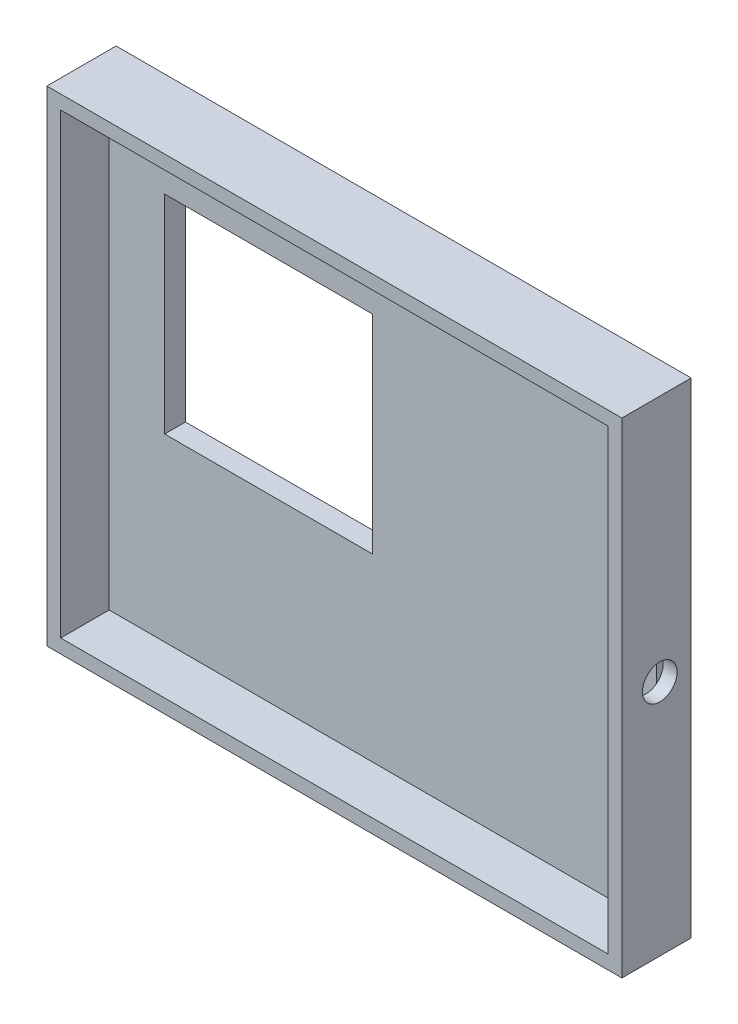
ISO-10303-21;
HEADER;
FILE_DESCRIPTION(('STEP AP214'),'2;1');
FILE_NAME('part.step','',(''),(''),'','','');
FILE_SCHEMA(('AUTOMOTIVE_DESIGN { 1 0 10303 214 1 1 1 1 }'));
ENDSEC;
DATA;
#1=APPLICATION_CONTEXT('core data for automotive mechanical design processes');
#2=APPLICATION_PROTOCOL_DEFINITION('international standard','automotive_design',2000,#1);
#3=PRODUCT_CONTEXT('',#1,'mechanical');
#4=PRODUCT('Part','Part','',(#3));
#5=PRODUCT_RELATED_PRODUCT_CATEGORY('part','',(#4));
#6=PRODUCT_DEFINITION_FORMATION('','',#4);
#7=PRODUCT_DEFINITION_CONTEXT('part definition',#1,'design');
#8=PRODUCT_DEFINITION('design','',#6,#7);
#9=PRODUCT_DEFINITION_SHAPE('','',#8);
#10=(LENGTH_UNIT() NAMED_UNIT(*) SI_UNIT(.MILLI.,.METRE.));
#11=(NAMED_UNIT(*) PLANE_ANGLE_UNIT() SI_UNIT($,.RADIAN.));
#12=(NAMED_UNIT(*) SI_UNIT($,.STERADIAN.) SOLID_ANGLE_UNIT());
#13=UNCERTAINTY_MEASURE_WITH_UNIT(LENGTH_MEASURE(1.E-05),#10,'distance_accuracy_value','');
#14=(GEOMETRIC_REPRESENTATION_CONTEXT(3) GLOBAL_UNCERTAINTY_ASSIGNED_CONTEXT((#13)) GLOBAL_UNIT_ASSIGNED_CONTEXT((#10,
#11,#12)) REPRESENTATION_CONTEXT('',''));
#15=CARTESIAN_POINT('',(0.,0.,0.));
#16=DIRECTION('',(0.,0.,1.));
#17=DIRECTION('',(1.,0.,0.));
#18=AXIS2_PLACEMENT_3D('',#15,#16,#17);
#19=CARTESIAN_POINT('',(0.,0.,10.));
#20=DIRECTION('',(1.,0.,0.));
#21=DIRECTION('',(0.,0.,-1.));
#22=AXIS2_PLACEMENT_3D('',#19,#20,#21);
#23=PLANE('',#22);
#24=DIRECTION('',(0.,-1.,0.));
#25=VECTOR('',#24,1.);
#26=CARTESIAN_POINT('',(0.,0.,0.));
#27=LINE('',#26,#25);
#28=CARTESIAN_POINT('',(0.,70.,0.));
#29=VERTEX_POINT('',#28);
#30=CARTESIAN_POINT('',(0.,0.,0.));
#31=VERTEX_POINT('',#30);
#32=EDGE_CURVE('E211',#29,#31,#27,.T.);
#33=ORIENTED_EDGE('',*,*,#32,.T.);
#34=DIRECTION('',(0.,0.,-1.));
#35=VECTOR('',#34,1.);
#36=CARTESIAN_POINT('',(0.,0.,10.));
#37=LINE('',#36,#35);
#38=CARTESIAN_POINT('',(0.,0.,10.));
#39=VERTEX_POINT('',#38);
#40=EDGE_CURVE('E221',#39,#31,#37,.T.);
#41=ORIENTED_EDGE('',*,*,#40,.F.);
#42=DIRECTION('',(0.,-1.,0.));
#43=VECTOR('',#42,1.);
#44=CARTESIAN_POINT('',(0.,0.,10.));
#45=LINE('',#44,#43);
#46=CARTESIAN_POINT('',(0.,70.,10.));
#47=VERTEX_POINT('',#46);
#48=EDGE_CURVE('E212',#47,#39,#45,.T.);
#49=ORIENTED_EDGE('',*,*,#48,.F.);
#50=DIRECTION('',(0.,0.,-1.));
#51=VECTOR('',#50,1.);
#52=CARTESIAN_POINT('',(0.,70.,10.));
#53=LINE('',#52,#51);
#54=EDGE_CURVE('E206',#47,#29,#53,.T.);
#55=ORIENTED_EDGE('',*,*,#54,.T.);
#56=EDGE_LOOP('',(#33,#41,#49,#55));
#57=FACE_BOUND('',#56,.T.);
#58=ADVANCED_FACE('F33',(#57),#23,.F.);
#59=CARTESIAN_POINT('',(0.,0.,10.));
#60=DIRECTION('',(0.,1.,0.));
#61=DIRECTION('',(0.,0.,1.));
#62=AXIS2_PLACEMENT_3D('',#59,#60,#61);
#63=PLANE('',#62);
#64=DIRECTION('',(1.,0.,0.));
#65=VECTOR('',#64,1.);
#66=CARTESIAN_POINT('',(0.,0.,0.));
#67=LINE('',#66,#65);
#68=CARTESIAN_POINT('',(83.,0.,0.));
#69=VERTEX_POINT('',#68);
#70=EDGE_CURVE('E200',#31,#69,#67,.T.);
#71=ORIENTED_EDGE('',*,*,#70,.T.);
#72=DIRECTION('',(0.,0.,-1.));
#73=VECTOR('',#72,1.);
#74=CARTESIAN_POINT('',(83.,0.,10.));
#75=LINE('',#74,#73);
#76=CARTESIAN_POINT('',(83.,0.,10.));
#77=VERTEX_POINT('',#76);
#78=EDGE_CURVE('E196',#77,#69,#75,.T.);
#79=ORIENTED_EDGE('',*,*,#78,.F.);
#80=DIRECTION('',(1.,0.,0.));
#81=VECTOR('',#80,1.);
#82=CARTESIAN_POINT('',(0.,0.,10.));
#83=LINE('',#82,#81);
#84=EDGE_CURVE('E215',#39,#77,#83,.T.);
#85=ORIENTED_EDGE('',*,*,#84,.F.);
#86=ORIENTED_EDGE('',*,*,#40,.T.);
#87=EDGE_LOOP('',(#71,#79,#85,#86));
#88=FACE_BOUND('',#87,.T.);
#89=ADVANCED_FACE('F185',(#88),#63,.F.);
#90=CARTESIAN_POINT('',(83.,0.,10.));
#91=DIRECTION('',(-1.,0.,0.));
#92=DIRECTION('',(0.,0.,1.));
#93=AXIS2_PLACEMENT_3D('',#90,#91,#92);
#94=PLANE('',#93);
#95=CARTESIAN_POINT('',(83.,34.2800778892201,4.5320506279928));
#96=DIRECTION('',(1.,0.,0.));
#97=DIRECTION('',(0.,0.,-1.));
#98=AXIS2_PLACEMENT_3D('',#95,#96,#97);
#99=CIRCLE('',#98,2.5);
#100=CARTESIAN_POINT('',(83.,34.2800778892201,2.0320506279928));
#101=VERTEX_POINT('',#100);
#102=EDGE_CURVE('E139',#101,#101,#99,.T.);
#103=ORIENTED_EDGE('',*,*,#102,.F.);
#104=EDGE_LOOP('',(#103));
#105=FACE_BOUND('',#104,.T.);
#106=DIRECTION('',(0.,1.,0.));
#107=VECTOR('',#106,1.);
#108=CARTESIAN_POINT('',(83.,0.,0.));
#109=LINE('',#108,#107);
#110=CARTESIAN_POINT('',(83.,70.,0.));
#111=VERTEX_POINT('',#110);
#112=EDGE_CURVE('E190',#69,#111,#109,.T.);
#113=ORIENTED_EDGE('',*,*,#112,.T.);
#114=DIRECTION('',(0.,0.,-1.));
#115=VECTOR('',#114,1.);
#116=CARTESIAN_POINT('',(83.,70.,10.));
#117=LINE('',#116,#115);
#118=CARTESIAN_POINT('',(83.,70.,10.));
#119=VERTEX_POINT('',#118);
#120=EDGE_CURVE('E193',#119,#111,#117,.T.);
#121=ORIENTED_EDGE('',*,*,#120,.F.);
#122=DIRECTION('',(0.,1.,0.));
#123=VECTOR('',#122,1.);
#124=CARTESIAN_POINT('',(83.,0.,10.));
#125=LINE('',#124,#123);
#126=EDGE_CURVE('E269',#77,#119,#125,.T.);
#127=ORIENTED_EDGE('',*,*,#126,.F.);
#128=ORIENTED_EDGE('',*,*,#78,.T.);
#129=EDGE_LOOP('',(#113,#121,#127,#128));
#130=FACE_BOUND('',#129,.T.);
#131=ADVANCED_FACE('F181',(#105,#130),#94,.F.);
#132=CARTESIAN_POINT('',(0.,70.,10.));
#133=DIRECTION('',(0.,-1.,0.));
#134=DIRECTION('',(0.,0.,-1.));
#135=AXIS2_PLACEMENT_3D('',#132,#133,#134);
#136=PLANE('',#135);
#137=DIRECTION('',(-1.,0.,0.));
#138=VECTOR('',#137,1.);
#139=CARTESIAN_POINT('',(0.,70.,0.));
#140=LINE('',#139,#138);
#141=EDGE_CURVE('E199',#111,#29,#140,.T.);
#142=ORIENTED_EDGE('',*,*,#141,.T.);
#143=ORIENTED_EDGE('',*,*,#54,.F.);
#144=DIRECTION('',(-1.,0.,0.));
#145=VECTOR('',#144,1.);
#146=CARTESIAN_POINT('',(0.,70.,10.));
#147=LINE('',#146,#145);
#148=EDGE_CURVE('E205',#119,#47,#147,.T.);
#149=ORIENTED_EDGE('',*,*,#148,.F.);
#150=ORIENTED_EDGE('',*,*,#120,.T.);
#151=EDGE_LOOP('',(#142,#143,#149,#150));
#152=FACE_BOUND('',#151,.T.);
#153=ADVANCED_FACE('F184',(#152),#136,.F.);
#154=CARTESIAN_POINT('',(0.,0.,10.));
#155=DIRECTION('',(0.,0.,-1.));
#156=DIRECTION('',(-1.,0.,0.));
#157=AXIS2_PLACEMENT_3D('',#154,#155,#156);
#158=PLANE('',#157);
#159=DIRECTION('',(1.,0.,0.));
#160=VECTOR('',#159,1.);
#161=CARTESIAN_POINT('',(2.,2.,10.));
#162=LINE('',#161,#160);
#163=CARTESIAN_POINT('',(2.,2.,10.));
#164=VERTEX_POINT('',#163);
#165=CARTESIAN_POINT('',(81.,2.,10.));
#166=VERTEX_POINT('',#165);
#167=EDGE_CURVE('E282',#164,#166,#162,.T.);
#168=ORIENTED_EDGE('',*,*,#167,.F.);
#169=DIRECTION('',(0.,-1.,0.));
#170=VECTOR('',#169,1.);
#171=CARTESIAN_POINT('',(2.,2.,10.));
#172=LINE('',#171,#170);
#173=CARTESIAN_POINT('',(2.,68.,10.));
#174=VERTEX_POINT('',#173);
#175=EDGE_CURVE('E168',#174,#164,#172,.T.);
#176=ORIENTED_EDGE('',*,*,#175,.F.);
#177=DIRECTION('',(-1.,0.,0.));
#178=VECTOR('',#177,1.);
#179=CARTESIAN_POINT('',(2.,68.,10.));
#180=LINE('',#179,#178);
#181=CARTESIAN_POINT('',(81.,68.,10.));
#182=VERTEX_POINT('',#181);
#183=EDGE_CURVE('E156',#182,#174,#180,.T.);
#184=ORIENTED_EDGE('',*,*,#183,.F.);
#185=DIRECTION('',(0.,1.,0.));
#186=VECTOR('',#185,1.);
#187=CARTESIAN_POINT('',(81.,2.,10.));
#188=LINE('',#187,#186);
#189=EDGE_CURVE('E279',#166,#182,#188,.T.);
#190=ORIENTED_EDGE('',*,*,#189,.F.);
#191=EDGE_LOOP('',(#168,#176,#184,#190));
#192=FACE_BOUND('',#191,.T.);
#193=ORIENTED_EDGE('',*,*,#48,.T.);
#194=ORIENTED_EDGE('',*,*,#84,.T.);
#195=ORIENTED_EDGE('',*,*,#126,.T.);
#196=ORIENTED_EDGE('',*,*,#148,.T.);
#197=EDGE_LOOP('',(#193,#194,#195,#196));
#198=FACE_BOUND('',#197,.T.);
#199=ADVANCED_FACE('F294',(#192,#198),#158,.F.);
#200=CARTESIAN_POINT('',(0.,0.,0.));
#201=DIRECTION('',(0.,0.,-1.));
#202=DIRECTION('',(-1.,0.,0.));
#203=AXIS2_PLACEMENT_3D('',#200,#201,#202);
#204=PLANE('',#203);
#205=DIRECTION('',(0.,-1.,0.));
#206=VECTOR('',#205,1.);
#207=CARTESIAN_POINT('',(40.,58.,0.));
#208=LINE('',#207,#206);
#209=CARTESIAN_POINT('',(40.,58.,0.));
#210=VERTEX_POINT('',#209);
#211=CARTESIAN_POINT('',(40.,28.,0.));
#212=VERTEX_POINT('',#211);
#213=EDGE_CURVE('E54',#210,#212,#208,.T.);
#214=ORIENTED_EDGE('',*,*,#213,.F.);
#215=DIRECTION('',(1.,0.,0.));
#216=VECTOR('',#215,1.);
#217=CARTESIAN_POINT('',(40.,58.,0.));
#218=LINE('',#217,#216);
#219=CARTESIAN_POINT('',(10.,58.,0.));
#220=VERTEX_POINT('',#219);
#221=EDGE_CURVE('E162',#220,#210,#218,.T.);
#222=ORIENTED_EDGE('',*,*,#221,.F.);
#223=DIRECTION('',(0.,1.,0.));
#224=VECTOR('',#223,1.);
#225=CARTESIAN_POINT('',(10.,58.,0.));
#226=LINE('',#225,#224);
#227=CARTESIAN_POINT('',(10.,28.,0.));
#228=VERTEX_POINT('',#227);
#229=EDGE_CURVE('E171',#228,#220,#226,.T.);
#230=ORIENTED_EDGE('',*,*,#229,.F.);
#231=DIRECTION('',(-1.,0.,0.));
#232=VECTOR('',#231,1.);
#233=CARTESIAN_POINT('',(40.,28.,0.));
#234=LINE('',#233,#232);
#235=EDGE_CURVE('E174',#212,#228,#234,.T.);
#236=ORIENTED_EDGE('',*,*,#235,.F.);
#237=EDGE_LOOP('',(#214,#222,#230,#236));
#238=FACE_BOUND('',#237,.T.);
#239=ORIENTED_EDGE('',*,*,#32,.F.);
#240=ORIENTED_EDGE('',*,*,#141,.F.);
#241=ORIENTED_EDGE('',*,*,#112,.F.);
#242=ORIENTED_EDGE('',*,*,#70,.F.);
#243=EDGE_LOOP('',(#239,#240,#241,#242));
#244=FACE_BOUND('',#243,.T.);
#245=ADVANCED_FACE('F209',(#238,#244),#204,.T.);
#246=CARTESIAN_POINT('',(2.,2.,3.));
#247=DIRECTION('',(-1.,0.,0.));
#248=DIRECTION('',(0.,0.,1.));
#249=AXIS2_PLACEMENT_3D('',#246,#247,#248);
#250=PLANE('',#249);
#251=ORIENTED_EDGE('',*,*,#175,.T.);
#252=DIRECTION('',(0.,0.,1.));
#253=VECTOR('',#252,1.);
#254=CARTESIAN_POINT('',(2.,2.,3.));
#255=LINE('',#254,#253);
#256=CARTESIAN_POINT('',(2.,2.,3.));
#257=VERTEX_POINT('',#256);
#258=EDGE_CURVE('E152',#257,#164,#255,.T.);
#259=ORIENTED_EDGE('',*,*,#258,.F.);
#260=DIRECTION('',(0.,-1.,0.));
#261=VECTOR('',#260,1.);
#262=CARTESIAN_POINT('',(2.,2.,3.));
#263=LINE('',#262,#261);
#264=CARTESIAN_POINT('',(2.,68.,3.));
#265=VERTEX_POINT('',#264);
#266=EDGE_CURVE('E155',#265,#257,#263,.T.);
#267=ORIENTED_EDGE('',*,*,#266,.F.);
#268=DIRECTION('',(0.,0.,1.));
#269=VECTOR('',#268,1.);
#270=CARTESIAN_POINT('',(2.,68.,3.));
#271=LINE('',#270,#269);
#272=EDGE_CURVE('E263',#265,#174,#271,.T.);
#273=ORIENTED_EDGE('',*,*,#272,.T.);
#274=EDGE_LOOP('',(#251,#259,#267,#273));
#275=FACE_BOUND('',#274,.T.);
#276=ADVANCED_FACE('F287',(#275),#250,.F.);
#277=CARTESIAN_POINT('',(2.,68.,3.));
#278=DIRECTION('',(0.,1.,0.));
#279=DIRECTION('',(0.,0.,1.));
#280=AXIS2_PLACEMENT_3D('',#277,#278,#279);
#281=PLANE('',#280);
#282=ORIENTED_EDGE('',*,*,#183,.T.);
#283=ORIENTED_EDGE('',*,*,#272,.F.);
#284=DIRECTION('',(-1.,0.,0.));
#285=VECTOR('',#284,1.);
#286=CARTESIAN_POINT('',(2.,68.,3.));
#287=LINE('',#286,#285);
#288=CARTESIAN_POINT('',(81.,68.,3.));
#289=VERTEX_POINT('',#288);
#290=EDGE_CURVE('E150',#289,#265,#287,.T.);
#291=ORIENTED_EDGE('',*,*,#290,.F.);
#292=DIRECTION('',(0.,0.,1.));
#293=VECTOR('',#292,1.);
#294=CARTESIAN_POINT('',(81.,68.,3.));
#295=LINE('',#294,#293);
#296=EDGE_CURVE('E265',#289,#182,#295,.T.);
#297=ORIENTED_EDGE('',*,*,#296,.T.);
#298=EDGE_LOOP('',(#282,#283,#291,#297));
#299=FACE_BOUND('',#298,.T.);
#300=ADVANCED_FACE('F298',(#299),#281,.F.);
#301=CARTESIAN_POINT('',(81.,2.,3.));
#302=DIRECTION('',(1.,0.,0.));
#303=DIRECTION('',(0.,0.,-1.));
#304=AXIS2_PLACEMENT_3D('',#301,#302,#303);
#305=PLANE('',#304);
#306=DIRECTION('',(0.,1.,0.));
#307=VECTOR('',#306,1.);
#308=CARTESIAN_POINT('',(81.,2.,3.));
#309=LINE('',#308,#307);
#310=CARTESIAN_POINT('',(81.,36.2556337282859,3.));
#311=VERTEX_POINT('',#310);
#312=EDGE_CURVE('E135',#311,#289,#309,.T.);
#313=ORIENTED_EDGE('',*,*,#312,.F.);
#314=CARTESIAN_POINT('',(81.,34.2800778892201,4.5320506279928));
#315=DIRECTION('',(1.,0.,0.));
#316=DIRECTION('',(0.,0.,-1.));
#317=AXIS2_PLACEMENT_3D('',#314,#315,#316);
#318=CIRCLE('',#317,2.5);
#319=CARTESIAN_POINT('',(81.,32.3045220501543,3.));
#320=VERTEX_POINT('',#319);
#321=EDGE_CURVE('E46',#311,#320,#318,.T.);
#322=ORIENTED_EDGE('',*,*,#321,.T.);
#323=CARTESIAN_POINT('',(81.,2.,3.));
#324=VERTEX_POINT('',#323);
#325=EDGE_CURVE('E134',#324,#320,#309,.T.);
#326=ORIENTED_EDGE('',*,*,#325,.F.);
#327=DIRECTION('',(0.,0.,1.));
#328=VECTOR('',#327,1.);
#329=CARTESIAN_POINT('',(81.,2.,3.));
#330=LINE('',#329,#328);
#331=EDGE_CURVE('E274',#324,#166,#330,.T.);
#332=ORIENTED_EDGE('',*,*,#331,.T.);
#333=ORIENTED_EDGE('',*,*,#189,.T.);
#334=ORIENTED_EDGE('',*,*,#296,.F.);
#335=EDGE_LOOP('',(#313,#322,#326,#332,#333,#334));
#336=FACE_BOUND('',#335,.T.);
#337=ADVANCED_FACE('F143',(#336),#305,.F.);
#338=CARTESIAN_POINT('',(2.,2.,3.));
#339=DIRECTION('',(0.,-1.,0.));
#340=DIRECTION('',(0.,0.,-1.));
#341=AXIS2_PLACEMENT_3D('',#338,#339,#340);
#342=PLANE('',#341);
#343=ORIENTED_EDGE('',*,*,#167,.T.);
#344=ORIENTED_EDGE('',*,*,#331,.F.);
#345=DIRECTION('',(1.,0.,0.));
#346=VECTOR('',#345,1.);
#347=CARTESIAN_POINT('',(2.,2.,3.));
#348=LINE('',#347,#346);
#349=EDGE_CURVE('E149',#257,#324,#348,.T.);
#350=ORIENTED_EDGE('',*,*,#349,.F.);
#351=ORIENTED_EDGE('',*,*,#258,.T.);
#352=EDGE_LOOP('',(#343,#344,#350,#351));
#353=FACE_BOUND('',#352,.T.);
#354=ADVANCED_FACE('F252',(#353),#342,.F.);
#355=CARTESIAN_POINT('',(0.,0.,3.));
#356=DIRECTION('',(0.,0.,-1.));
#357=DIRECTION('',(-1.,0.,0.));
#358=AXIS2_PLACEMENT_3D('',#355,#356,#357);
#359=PLANE('',#358);
#360=DIRECTION('',(1.,0.,0.));
#361=VECTOR('',#360,1.);
#362=CARTESIAN_POINT('',(0.,58.,3.));
#363=LINE('',#362,#361);
#364=CARTESIAN_POINT('',(10.,58.,3.));
#365=VERTEX_POINT('',#364);
#366=CARTESIAN_POINT('',(40.,58.,3.));
#367=VERTEX_POINT('',#366);
#368=EDGE_CURVE('E40',#365,#367,#363,.T.);
#369=ORIENTED_EDGE('',*,*,#368,.T.);
#370=DIRECTION('',(0.,-1.,0.));
#371=VECTOR('',#370,1.);
#372=CARTESIAN_POINT('',(40.,0.,3.));
#373=LINE('',#372,#371);
#374=CARTESIAN_POINT('',(40.,28.,3.));
#375=VERTEX_POINT('',#374);
#376=EDGE_CURVE('E11',#367,#375,#373,.T.);
#377=ORIENTED_EDGE('',*,*,#376,.T.);
#378=DIRECTION('',(-1.,0.,0.));
#379=VECTOR('',#378,1.);
#380=CARTESIAN_POINT('',(0.,28.,3.));
#381=LINE('',#380,#379);
#382=CARTESIAN_POINT('',(10.,28.,3.));
#383=VERTEX_POINT('',#382);
#384=EDGE_CURVE('E224',#375,#383,#381,.T.);
#385=ORIENTED_EDGE('',*,*,#384,.T.);
#386=DIRECTION('',(0.,1.,0.));
#387=VECTOR('',#386,1.);
#388=CARTESIAN_POINT('',(9.99999999999999,0.,3.));
#389=LINE('',#388,#387);
#390=EDGE_CURVE('E227',#383,#365,#389,.T.);
#391=ORIENTED_EDGE('',*,*,#390,.T.);
#392=EDGE_LOOP('',(#369,#377,#385,#391));
#393=FACE_BOUND('',#392,.T.);
#394=ORIENTED_EDGE('',*,*,#266,.T.);
#395=ORIENTED_EDGE('',*,*,#349,.T.);
#396=ORIENTED_EDGE('',*,*,#325,.T.);
#397=EDGE_CURVE('E128',#320,#311,#309,.T.);
#398=ORIENTED_EDGE('',*,*,#397,.T.);
#399=ORIENTED_EDGE('',*,*,#312,.T.);
#400=ORIENTED_EDGE('',*,*,#290,.T.);
#401=EDGE_LOOP('',(#394,#395,#396,#398,#399,#400));
#402=FACE_BOUND('',#401,.T.);
#403=ADVANCED_FACE('F147',(#393,#402),#359,.F.);
#404=CARTESIAN_POINT('',(40.,58.,7.));
#405=DIRECTION('',(1.,0.,0.));
#406=DIRECTION('',(0.,1.,0.));
#407=AXIS2_PLACEMENT_3D('',#404,#405,#406);
#408=PLANE('',#407);
#409=DIRECTION('',(0.,0.,-1.));
#410=VECTOR('',#409,1.);
#411=CARTESIAN_POINT('',(40.,58.,7.));
#412=LINE('',#411,#410);
#413=EDGE_CURVE('E166',#367,#210,#412,.T.);
#414=ORIENTED_EDGE('',*,*,#413,.T.);
#415=ORIENTED_EDGE('',*,*,#213,.T.);
#416=DIRECTION('',(0.,0.,-1.));
#417=VECTOR('',#416,1.);
#418=CARTESIAN_POINT('',(40.,28.,7.));
#419=LINE('',#418,#417);
#420=EDGE_CURVE('E159',#375,#212,#419,.T.);
#421=ORIENTED_EDGE('',*,*,#420,.F.);
#422=ORIENTED_EDGE('',*,*,#376,.F.);
#423=EDGE_LOOP('',(#414,#415,#421,#422));
#424=FACE_BOUND('',#423,.T.);
#425=ADVANCED_FACE('F244',(#424),#408,.F.);
#426=CARTESIAN_POINT('',(40.,58.,7.));
#427=DIRECTION('',(0.,1.,0.));
#428=DIRECTION('',(0.,0.,1.));
#429=AXIS2_PLACEMENT_3D('',#426,#427,#428);
#430=PLANE('',#429);
#431=DIRECTION('',(0.,0.,-1.));
#432=VECTOR('',#431,1.);
#433=CARTESIAN_POINT('',(10.,58.,7.));
#434=LINE('',#433,#432);
#435=EDGE_CURVE('E164',#365,#220,#434,.T.);
#436=ORIENTED_EDGE('',*,*,#435,.T.);
#437=ORIENTED_EDGE('',*,*,#221,.T.);
#438=ORIENTED_EDGE('',*,*,#413,.F.);
#439=ORIENTED_EDGE('',*,*,#368,.F.);
#440=EDGE_LOOP('',(#436,#437,#438,#439));
#441=FACE_BOUND('',#440,.T.);
#442=ADVANCED_FACE('F235',(#441),#430,.F.);
#443=CARTESIAN_POINT('',(10.,58.,7.));
#444=DIRECTION('',(-1.,0.,0.));
#445=DIRECTION('',(0.,-1.,0.));
#446=AXIS2_PLACEMENT_3D('',#443,#444,#445);
#447=PLANE('',#446);
#448=DIRECTION('',(0.,0.,-1.));
#449=VECTOR('',#448,1.);
#450=CARTESIAN_POINT('',(10.,28.,7.));
#451=LINE('',#450,#449);
#452=EDGE_CURVE('E161',#383,#228,#451,.T.);
#453=ORIENTED_EDGE('',*,*,#452,.T.);
#454=ORIENTED_EDGE('',*,*,#229,.T.);
#455=ORIENTED_EDGE('',*,*,#435,.F.);
#456=ORIENTED_EDGE('',*,*,#390,.F.);
#457=EDGE_LOOP('',(#453,#454,#455,#456));
#458=FACE_BOUND('',#457,.T.);
#459=ADVANCED_FACE('F237',(#458),#447,.F.);
#460=CARTESIAN_POINT('',(40.,28.,7.));
#461=DIRECTION('',(0.,-1.,0.));
#462=DIRECTION('',(0.,0.,-1.));
#463=AXIS2_PLACEMENT_3D('',#460,#461,#462);
#464=PLANE('',#463);
#465=ORIENTED_EDGE('',*,*,#420,.T.);
#466=ORIENTED_EDGE('',*,*,#235,.T.);
#467=ORIENTED_EDGE('',*,*,#452,.F.);
#468=ORIENTED_EDGE('',*,*,#384,.F.);
#469=EDGE_LOOP('',(#465,#466,#467,#468));
#470=FACE_BOUND('',#469,.T.);
#471=ADVANCED_FACE('F243',(#470),#464,.F.);
#472=CARTESIAN_POINT('',(81.,34.2800778892201,4.5320506279928));
#473=DIRECTION('',(1.,0.,0.));
#474=DIRECTION('',(0.,0.,-1.));
#475=AXIS2_PLACEMENT_3D('',#472,#473,#474);
#476=PLANE('',#475);
#477=ORIENTED_EDGE('',*,*,#397,.F.);
#478=EDGE_CURVE('E130',#320,#311,#318,.T.);
#479=ORIENTED_EDGE('',*,*,#478,.T.);
#480=EDGE_LOOP('',(#477,#479));
#481=FACE_BOUND('',#480,.T.);
#482=ADVANCED_FACE('F129',(#481),#476,.T.);
#483=CARTESIAN_POINT('',(81.,34.2800778892201,4.5320506279928));
#484=DIRECTION('',(1.,0.,0.));
#485=DIRECTION('',(0.,0.,-1.));
#486=AXIS2_PLACEMENT_3D('',#483,#484,#485);
#487=CYLINDRICAL_SURFACE('',#486,2.5);
#488=ORIENTED_EDGE('',*,*,#321,.F.);
#489=ORIENTED_EDGE('',*,*,#478,.F.);
#490=EDGE_LOOP('',(#488,#489));
#491=FACE_BOUND('',#490,.T.);
#492=ORIENTED_EDGE('',*,*,#102,.T.);
#493=EDGE_LOOP('',(#492));
#494=FACE_BOUND('',#493,.T.);
#495=ADVANCED_FACE('F137',(#491,#494),#487,.F.);
#496=CLOSED_SHELL('',(#58,#89,#131,#153,#199,#245,#276,#300,#337,#354,#403,#425,#442,#459,#471,
#482,#495));
#497=MANIFOLD_SOLID_BREP('B2',#496);
#498=ADVANCED_BREP_SHAPE_REPRESENTATION('',(#18,#497),#14);
#499=SHAPE_DEFINITION_REPRESENTATION(#9,#498);
ENDSEC;
END-ISO-10303-21;
